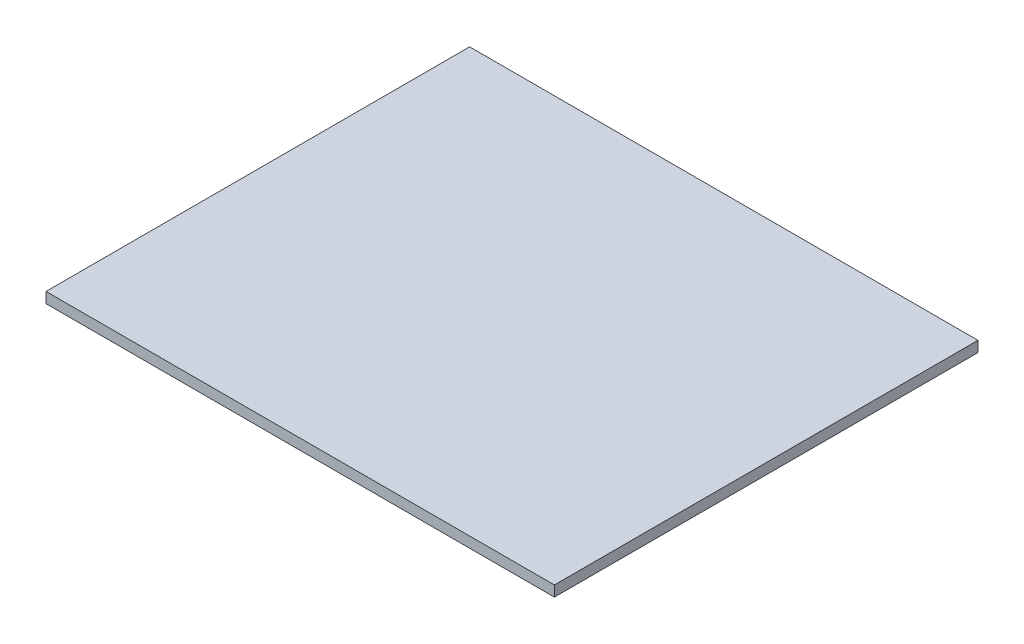
ISO-10303-21;
HEADER;
FILE_DESCRIPTION(('STEP AP214'),'2;1');
FILE_NAME('part.step','',(''),(''),'','','');
FILE_SCHEMA(('AUTOMOTIVE_DESIGN { 1 0 10303 214 1 1 1 1 }'));
ENDSEC;
DATA;
#1=APPLICATION_CONTEXT('core data for automotive mechanical design processes');
#2=APPLICATION_PROTOCOL_DEFINITION('international standard','automotive_design',2000,#1);
#3=PRODUCT_CONTEXT('',#1,'mechanical');
#4=PRODUCT('Part','Part','',(#3));
#5=PRODUCT_RELATED_PRODUCT_CATEGORY('part','',(#4));
#6=PRODUCT_DEFINITION_FORMATION('','',#4);
#7=PRODUCT_DEFINITION_CONTEXT('part definition',#1,'design');
#8=PRODUCT_DEFINITION('design','',#6,#7);
#9=PRODUCT_DEFINITION_SHAPE('','',#8);
#10=(LENGTH_UNIT() NAMED_UNIT(*) SI_UNIT(.MILLI.,.METRE.));
#11=(NAMED_UNIT(*) PLANE_ANGLE_UNIT() SI_UNIT($,.RADIAN.));
#12=(NAMED_UNIT(*) SI_UNIT($,.STERADIAN.) SOLID_ANGLE_UNIT());
#13=UNCERTAINTY_MEASURE_WITH_UNIT(LENGTH_MEASURE(1.E-05),#10,'distance_accuracy_value','');
#14=(GEOMETRIC_REPRESENTATION_CONTEXT(3) GLOBAL_UNCERTAINTY_ASSIGNED_CONTEXT((#13)) GLOBAL_UNIT_ASSIGNED_CONTEXT((#10,
#11,#12)) REPRESENTATION_CONTEXT('',''));
#15=CARTESIAN_POINT('',(0.,0.,0.));
#16=DIRECTION('',(0.,0.,1.));
#17=DIRECTION('',(1.,0.,0.));
#18=AXIS2_PLACEMENT_3D('',#15,#16,#17);
#19=CARTESIAN_POINT('',(152.4,6.35,127.));
#20=DIRECTION('',(-1.,0.,0.));
#21=DIRECTION('',(0.,0.,1.));
#22=AXIS2_PLACEMENT_3D('',#19,#20,#21);
#23=PLANE('',#22);
#24=DIRECTION('',(0.,0.,-1.));
#25=VECTOR('',#24,1.);
#26=CARTESIAN_POINT('',(152.4,0.,127.));
#27=LINE('',#26,#25);
#28=CARTESIAN_POINT('',(152.4,0.,127.));
#29=VERTEX_POINT('',#28);
#30=CARTESIAN_POINT('',(152.4,0.,-127.));
#31=VERTEX_POINT('',#30);
#32=EDGE_CURVE('E96',#29,#31,#27,.T.);
#33=ORIENTED_EDGE('',*,*,#32,.T.);
#34=DIRECTION('',(0.,-1.,0.));
#35=VECTOR('',#34,1.);
#36=CARTESIAN_POINT('',(152.4,6.35,-127.));
#37=LINE('',#36,#35);
#38=CARTESIAN_POINT('',(152.4,6.35,-127.));
#39=VERTEX_POINT('',#38);
#40=EDGE_CURVE('E11',#39,#31,#37,.T.);
#41=ORIENTED_EDGE('',*,*,#40,.F.);
#42=DIRECTION('',(0.,0.,-1.));
#43=VECTOR('',#42,1.);
#44=CARTESIAN_POINT('',(152.4,6.35,127.));
#45=LINE('',#44,#43);
#46=CARTESIAN_POINT('',(152.4,6.35,127.));
#47=VERTEX_POINT('',#46);
#48=EDGE_CURVE('E84',#47,#39,#45,.T.);
#49=ORIENTED_EDGE('',*,*,#48,.F.);
#50=DIRECTION('',(0.,-1.,0.));
#51=VECTOR('',#50,1.);
#52=CARTESIAN_POINT('',(152.4,6.35,127.));
#53=LINE('',#52,#51);
#54=EDGE_CURVE('E92',#47,#29,#53,.T.);
#55=ORIENTED_EDGE('',*,*,#54,.T.);
#56=EDGE_LOOP('',(#33,#41,#49,#55));
#57=FACE_BOUND('',#56,.T.);
#58=ADVANCED_FACE('F33',(#57),#23,.F.);
#59=CARTESIAN_POINT('',(-152.4,6.35,-127.));
#60=DIRECTION('',(0.,0.,1.));
#61=DIRECTION('',(1.,0.,0.));
#62=AXIS2_PLACEMENT_3D('',#59,#60,#61);
#63=PLANE('',#62);
#64=DIRECTION('',(-1.,0.,0.));
#65=VECTOR('',#64,1.);
#66=CARTESIAN_POINT('',(-152.4,0.,-127.));
#67=LINE('',#66,#65);
#68=CARTESIAN_POINT('',(-152.4,0.,-127.));
#69=VERTEX_POINT('',#68);
#70=EDGE_CURVE('E88',#31,#69,#67,.T.);
#71=ORIENTED_EDGE('',*,*,#70,.T.);
#72=DIRECTION('',(0.,-1.,0.));
#73=VECTOR('',#72,1.);
#74=CARTESIAN_POINT('',(-152.4,6.35,-127.));
#75=LINE('',#74,#73);
#76=CARTESIAN_POINT('',(-152.4,6.35,-127.));
#77=VERTEX_POINT('',#76);
#78=EDGE_CURVE('E41',#77,#69,#75,.T.);
#79=ORIENTED_EDGE('',*,*,#78,.F.);
#80=DIRECTION('',(-1.,0.,0.));
#81=VECTOR('',#80,1.);
#82=CARTESIAN_POINT('',(-152.4,6.35,-127.));
#83=LINE('',#82,#81);
#84=EDGE_CURVE('E79',#39,#77,#83,.T.);
#85=ORIENTED_EDGE('',*,*,#84,.F.);
#86=ORIENTED_EDGE('',*,*,#40,.T.);
#87=EDGE_LOOP('',(#71,#79,#85,#86));
#88=FACE_BOUND('',#87,.T.);
#89=ADVANCED_FACE('F87',(#88),#63,.F.);
#90=CARTESIAN_POINT('',(-152.4,6.35,127.));
#91=DIRECTION('',(1.,0.,0.));
#92=DIRECTION('',(0.,0.,-1.));
#93=AXIS2_PLACEMENT_3D('',#90,#91,#92);
#94=PLANE('',#93);
#95=DIRECTION('',(0.,0.,1.));
#96=VECTOR('',#95,1.);
#97=CARTESIAN_POINT('',(-152.4,0.,127.));
#98=LINE('',#97,#96);
#99=CARTESIAN_POINT('',(-152.4,0.,127.));
#100=VERTEX_POINT('',#99);
#101=EDGE_CURVE('E66',#69,#100,#98,.T.);
#102=ORIENTED_EDGE('',*,*,#101,.T.);
#103=DIRECTION('',(0.,-1.,0.));
#104=VECTOR('',#103,1.);
#105=CARTESIAN_POINT('',(-152.4,6.35,127.));
#106=LINE('',#105,#104);
#107=CARTESIAN_POINT('',(-152.4,6.35,127.));
#108=VERTEX_POINT('',#107);
#109=EDGE_CURVE('E89',#108,#100,#106,.T.);
#110=ORIENTED_EDGE('',*,*,#109,.F.);
#111=DIRECTION('',(0.,0.,1.));
#112=VECTOR('',#111,1.);
#113=CARTESIAN_POINT('',(-152.4,6.35,127.));
#114=LINE('',#113,#112);
#115=EDGE_CURVE('E82',#77,#108,#114,.T.);
#116=ORIENTED_EDGE('',*,*,#115,.F.);
#117=ORIENTED_EDGE('',*,*,#78,.T.);
#118=EDGE_LOOP('',(#102,#110,#116,#117));
#119=FACE_BOUND('',#118,.T.);
#120=ADVANCED_FACE('F90',(#119),#94,.F.);
#121=CARTESIAN_POINT('',(-152.4,6.35,127.));
#122=DIRECTION('',(0.,0.,-1.));
#123=DIRECTION('',(-1.,0.,0.));
#124=AXIS2_PLACEMENT_3D('',#121,#122,#123);
#125=PLANE('',#124);
#126=DIRECTION('',(1.,0.,0.));
#127=VECTOR('',#126,1.);
#128=CARTESIAN_POINT('',(-152.4,0.,127.));
#129=LINE('',#128,#127);
#130=EDGE_CURVE('E72',#100,#29,#129,.T.);
#131=ORIENTED_EDGE('',*,*,#130,.T.);
#132=ORIENTED_EDGE('',*,*,#54,.F.);
#133=DIRECTION('',(1.,0.,0.));
#134=VECTOR('',#133,1.);
#135=CARTESIAN_POINT('',(-152.4,6.35,127.));
#136=LINE('',#135,#134);
#137=EDGE_CURVE('E49',#108,#47,#136,.T.);
#138=ORIENTED_EDGE('',*,*,#137,.F.);
#139=ORIENTED_EDGE('',*,*,#109,.T.);
#140=EDGE_LOOP('',(#131,#132,#138,#139));
#141=FACE_BOUND('',#140,.T.);
#142=ADVANCED_FACE('F103',(#141),#125,.F.);
#143=CARTESIAN_POINT('',(0.,6.35,0.));
#144=DIRECTION('',(0.,-1.,0.));
#145=DIRECTION('',(0.,0.,-1.));
#146=AXIS2_PLACEMENT_3D('',#143,#144,#145);
#147=PLANE('',#146);
#148=ORIENTED_EDGE('',*,*,#48,.T.);
#149=ORIENTED_EDGE('',*,*,#84,.T.);
#150=ORIENTED_EDGE('',*,*,#115,.T.);
#151=ORIENTED_EDGE('',*,*,#137,.T.);
#152=EDGE_LOOP('',(#148,#149,#150,#151));
#153=FACE_BOUND('',#152,.T.);
#154=ADVANCED_FACE('F80',(#153),#147,.F.);
#155=CARTESIAN_POINT('',(0.,0.,0.));
#156=DIRECTION('',(0.,-1.,0.));
#157=DIRECTION('',(0.,0.,-1.));
#158=AXIS2_PLACEMENT_3D('',#155,#156,#157);
#159=PLANE('',#158);
#160=ORIENTED_EDGE('',*,*,#32,.F.);
#161=ORIENTED_EDGE('',*,*,#130,.F.);
#162=ORIENTED_EDGE('',*,*,#101,.F.);
#163=ORIENTED_EDGE('',*,*,#70,.F.);
#164=EDGE_LOOP('',(#160,#161,#162,#163));
#165=FACE_BOUND('',#164,.T.);
#166=ADVANCED_FACE('F106',(#165),#159,.T.);
#167=CLOSED_SHELL('',(#58,#89,#120,#142,#154,#166));
#168=MANIFOLD_SOLID_BREP('B2',#167);
#169=ADVANCED_BREP_SHAPE_REPRESENTATION('',(#18,#168),#14);
#170=SHAPE_DEFINITION_REPRESENTATION(#9,#169);
ENDSEC;
END-ISO-10303-21;
